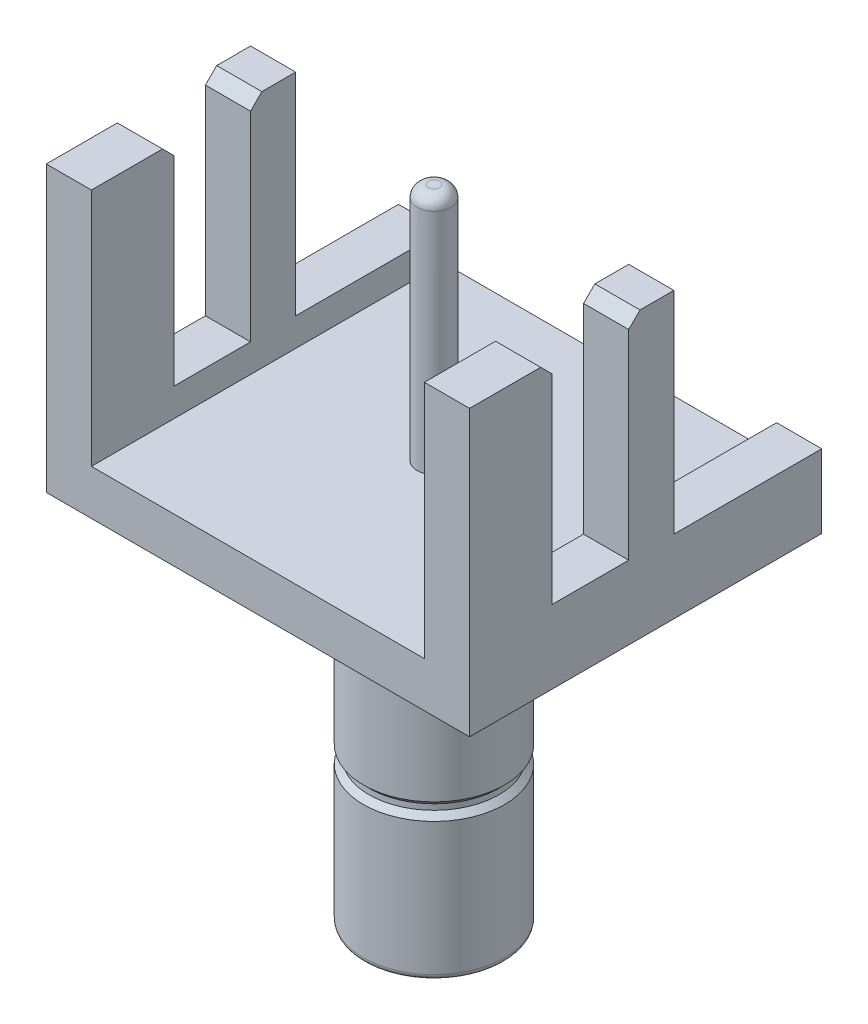
ISO-10303-21;
HEADER;
FILE_DESCRIPTION(('STEP AP214'),'2;1');
FILE_NAME('part.step','',(''),(''),'','','');
FILE_SCHEMA(('AUTOMOTIVE_DESIGN { 1 0 10303 214 1 1 1 1 }'));
ENDSEC;
DATA;
#1=APPLICATION_CONTEXT('core data for automotive mechanical design processes');
#2=APPLICATION_PROTOCOL_DEFINITION('international standard','automotive_design',2000,#1);
#3=PRODUCT_CONTEXT('',#1,'mechanical');
#4=PRODUCT('Part','Part','',(#3));
#5=PRODUCT_RELATED_PRODUCT_CATEGORY('part','',(#4));
#6=PRODUCT_DEFINITION_FORMATION('','',#4);
#7=PRODUCT_DEFINITION_CONTEXT('part definition',#1,'design');
#8=PRODUCT_DEFINITION('design','',#6,#7);
#9=PRODUCT_DEFINITION_SHAPE('','',#8);
#10=(LENGTH_UNIT() NAMED_UNIT(*) SI_UNIT(.MILLI.,.METRE.));
#11=(NAMED_UNIT(*) PLANE_ANGLE_UNIT() SI_UNIT($,.RADIAN.));
#12=(NAMED_UNIT(*) SI_UNIT($,.STERADIAN.) SOLID_ANGLE_UNIT());
#13=UNCERTAINTY_MEASURE_WITH_UNIT(LENGTH_MEASURE(1.E-05),#10,'distance_accuracy_value','');
#14=(GEOMETRIC_REPRESENTATION_CONTEXT(3) GLOBAL_UNCERTAINTY_ASSIGNED_CONTEXT((#13)) GLOBAL_UNIT_ASSIGNED_CONTEXT((#10,
#11,#12)) REPRESENTATION_CONTEXT('',''));
#15=CARTESIAN_POINT('',(0.,0.,0.));
#16=DIRECTION('',(0.,0.,1.));
#17=DIRECTION('',(1.,0.,0.));
#18=AXIS2_PLACEMENT_3D('',#15,#16,#17);
#19=CARTESIAN_POINT('',(0.,-8.001,0.));
#20=DIRECTION('',(0.,1.,0.));
#21=DIRECTION('',(0.,0.,1.));
#22=AXIS2_PLACEMENT_3D('',#19,#20,#21);
#23=CYLINDRICAL_SURFACE('',#22,0.381);
#24=CARTESIAN_POINT('',(0.,0.,0.));
#25=DIRECTION('',(0.,-1.,0.));
#26=DIRECTION('',(0.,0.,-1.));
#27=AXIS2_PLACEMENT_3D('',#24,#25,#26);
#28=CIRCLE('',#27,0.381);
#29=CARTESIAN_POINT('',(0.,0.,-0.381));
#30=VERTEX_POINT('',#29);
#31=EDGE_CURVE('E855',#30,#30,#28,.T.);
#32=ORIENTED_EDGE('',*,*,#31,.T.);
#33=EDGE_LOOP('',(#32));
#34=FACE_BOUND('',#33,.T.);
#35=CARTESIAN_POINT('',(0.,-6.477,0.));
#36=DIRECTION('',(0.,-1.,0.));
#37=DIRECTION('',(0.,0.,-1.));
#38=AXIS2_PLACEMENT_3D('',#35,#36,#37);
#39=CIRCLE('',#38,0.381);
#40=CARTESIAN_POINT('',(0.,-6.477,-0.381));
#41=VERTEX_POINT('',#40);
#42=EDGE_CURVE('E838',#41,#41,#39,.T.);
#43=ORIENTED_EDGE('',*,*,#42,.F.);
#44=EDGE_LOOP('',(#43));
#45=FACE_BOUND('',#44,.T.);
#46=ADVANCED_FACE('F47',(#34,#45),#23,.T.);
#47=CARTESIAN_POINT('',(0.,-8.001,0.));
#48=DIRECTION('',(0.,1.,0.));
#49=DIRECTION('',(0.,0.,1.));
#50=AXIS2_PLACEMENT_3D('',#47,#48,#49);
#51=CYLINDRICAL_SURFACE('',#50,1.5875);
#52=CARTESIAN_POINT('',(0.,-4.5085,0.));
#53=DIRECTION('',(0.,-1.,0.));
#54=DIRECTION('',(0.,0.,-1.));
#55=AXIS2_PLACEMENT_3D('',#52,#53,#54);
#56=CIRCLE('',#55,1.5875);
#57=CARTESIAN_POINT('',(0.,-4.5085,-1.5875));
#58=VERTEX_POINT('',#57);
#59=EDGE_CURVE('E852',#58,#58,#56,.T.);
#60=ORIENTED_EDGE('',*,*,#59,.F.);
#61=EDGE_LOOP('',(#60));
#62=FACE_BOUND('',#61,.T.);
#63=CARTESIAN_POINT('',(0.,0.,0.));
#64=DIRECTION('',(0.,-1.,0.));
#65=DIRECTION('',(0.,0.,-1.));
#66=AXIS2_PLACEMENT_3D('',#63,#64,#65);
#67=CIRCLE('',#66,1.5875);
#68=CARTESIAN_POINT('',(0.,0.,-1.5875));
#69=VERTEX_POINT('',#68);
#70=EDGE_CURVE('E244',#69,#69,#67,.T.);
#71=ORIENTED_EDGE('',*,*,#70,.T.);
#72=EDGE_LOOP('',(#71));
#73=FACE_BOUND('',#72,.T.);
#74=ADVANCED_FACE('F434',(#62,#73),#51,.T.);
#75=CARTESIAN_POINT('',(0.,1.651,0.));
#76=DIRECTION('',(0.,-1.,0.));
#77=DIRECTION('',(0.,0.,-1.));
#78=AXIS2_PLACEMENT_3D('',#75,#76,#77);
#79=PLANE('',#78);
#80=DIRECTION('',(-1.,0.,0.));
#81=VECTOR('',#80,1.);
#82=CARTESIAN_POINT('',(4.7625,1.651,2.1082));
#83=LINE('',#82,#81);
#84=CARTESIAN_POINT('',(4.7625,1.651,2.1082));
#85=VERTEX_POINT('',#84);
#86=CARTESIAN_POINT('',(3.7465,1.651,2.1082));
#87=VERTEX_POINT('',#86);
#88=EDGE_CURVE('E238',#85,#87,#83,.T.);
#89=ORIENTED_EDGE('',*,*,#88,.F.);
#90=DIRECTION('',(0.,0.,-1.));
#91=VECTOR('',#90,1.);
#92=CARTESIAN_POINT('',(4.7625,1.651,-3.9624));
#93=LINE('',#92,#91);
#94=CARTESIAN_POINT('',(4.7625,1.651,0.380999999999999));
#95=VERTEX_POINT('',#94);
#96=EDGE_CURVE('E315',#85,#95,#93,.T.);
#97=ORIENTED_EDGE('',*,*,#96,.T.);
#98=DIRECTION('',(1.,0.,0.));
#99=VECTOR('',#98,1.);
#100=CARTESIAN_POINT('',(4.7625,1.651,0.381));
#101=LINE('',#100,#99);
#102=CARTESIAN_POINT('',(3.7465,1.651,0.380999999999999));
#103=VERTEX_POINT('',#102);
#104=EDGE_CURVE('E257',#103,#95,#101,.T.);
#105=ORIENTED_EDGE('',*,*,#104,.F.);
#106=DIRECTION('',(0.,0.,1.));
#107=VECTOR('',#106,1.);
#108=CARTESIAN_POINT('',(3.7465,1.651,-3.9624));
#109=LINE('',#108,#107);
#110=EDGE_CURVE('E321',#103,#87,#109,.T.);
#111=ORIENTED_EDGE('',*,*,#110,.T.);
#112=EDGE_LOOP('',(#89,#97,#105,#111));
#113=FACE_BOUND('',#112,.T.);
#114=ADVANCED_FACE('F440',(#113),#79,.F.);
#115=DIRECTION('',(-1.,0.,0.));
#116=VECTOR('',#115,1.);
#117=CARTESIAN_POINT('',(4.7625,1.651,-0.635));
#118=LINE('',#117,#116);
#119=CARTESIAN_POINT('',(4.7625,1.651,-0.635));
#120=VERTEX_POINT('',#119);
#121=CARTESIAN_POINT('',(3.7465,1.651,-0.635));
#122=VERTEX_POINT('',#121);
#123=EDGE_CURVE('E252',#120,#122,#118,.T.);
#124=ORIENTED_EDGE('',*,*,#123,.F.);
#125=CARTESIAN_POINT('',(4.7625,1.651,-3.9624));
#126=VERTEX_POINT('',#125);
#127=EDGE_CURVE('E319',#120,#126,#93,.T.);
#128=ORIENTED_EDGE('',*,*,#127,.T.);
#129=DIRECTION('',(-1.,0.,0.));
#130=VECTOR('',#129,1.);
#131=CARTESIAN_POINT('',(4.7625,1.651,-3.9624));
#132=LINE('',#131,#130);
#133=CARTESIAN_POINT('',(3.7465,1.651,-3.9624));
#134=VERTEX_POINT('',#133);
#135=EDGE_CURVE('E318',#126,#134,#132,.T.);
#136=ORIENTED_EDGE('',*,*,#135,.T.);
#137=EDGE_CURVE('E322',#134,#122,#109,.T.);
#138=ORIENTED_EDGE('',*,*,#137,.T.);
#139=EDGE_LOOP('',(#124,#128,#136,#138));
#140=FACE_BOUND('',#139,.T.);
#141=ADVANCED_FACE('F510',(#140),#79,.F.);
#142=CARTESIAN_POINT('',(0.,1.651,0.));
#143=DIRECTION('',(0.,1.,0.));
#144=DIRECTION('',(0.,0.,1.));
#145=AXIS2_PLACEMENT_3D('',#142,#143,#144);
#146=PLANE('',#145);
#147=DIRECTION('',(0.,0.,-1.));
#148=VECTOR('',#147,1.);
#149=CARTESIAN_POINT('',(-3.7465,1.651,-3.9624));
#150=LINE('',#149,#148);
#151=CARTESIAN_POINT('',(-3.7465,1.651,2.1082));
#152=VERTEX_POINT('',#151);
#153=CARTESIAN_POINT('',(-3.7465,1.651,0.381));
#154=VERTEX_POINT('',#153);
#155=EDGE_CURVE('E336',#152,#154,#150,.T.);
#156=ORIENTED_EDGE('',*,*,#155,.T.);
#157=DIRECTION('',(1.,0.,0.));
#158=VECTOR('',#157,1.);
#159=CARTESIAN_POINT('',(-4.7625,1.651,0.381));
#160=LINE('',#159,#158);
#161=CARTESIAN_POINT('',(-4.7625,1.651,0.380999999999999));
#162=VERTEX_POINT('',#161);
#163=EDGE_CURVE('E276',#162,#154,#160,.T.);
#164=ORIENTED_EDGE('',*,*,#163,.F.);
#165=DIRECTION('',(0.,0.,1.));
#166=VECTOR('',#165,1.);
#167=CARTESIAN_POINT('',(-4.7625,1.651,-3.9624));
#168=LINE('',#167,#166);
#169=CARTESIAN_POINT('',(-4.7625,1.651,2.1082));
#170=VERTEX_POINT('',#169);
#171=EDGE_CURVE('E335',#162,#170,#168,.T.);
#172=ORIENTED_EDGE('',*,*,#171,.T.);
#173=DIRECTION('',(-1.,0.,0.));
#174=VECTOR('',#173,1.);
#175=CARTESIAN_POINT('',(-4.7625,1.651,2.1082));
#176=LINE('',#175,#174);
#177=EDGE_CURVE('E299',#152,#170,#176,.T.);
#178=ORIENTED_EDGE('',*,*,#177,.F.);
#179=EDGE_LOOP('',(#156,#164,#172,#178));
#180=FACE_BOUND('',#179,.T.);
#181=ADVANCED_FACE('F513',(#180),#146,.T.);
#182=CARTESIAN_POINT('',(-4.7625,1.651,-3.9624));
#183=VERTEX_POINT('',#182);
#184=CARTESIAN_POINT('',(-4.7625,1.651,-0.635000000000001));
#185=VERTEX_POINT('',#184);
#186=EDGE_CURVE('E332',#183,#185,#168,.T.);
#187=ORIENTED_EDGE('',*,*,#186,.T.);
#188=DIRECTION('',(-1.,0.,0.));
#189=VECTOR('',#188,1.);
#190=CARTESIAN_POINT('',(-4.7625,1.651,-0.635));
#191=LINE('',#190,#189);
#192=CARTESIAN_POINT('',(-3.7465,1.651,-0.635));
#193=VERTEX_POINT('',#192);
#194=EDGE_CURVE('E281',#193,#185,#191,.T.);
#195=ORIENTED_EDGE('',*,*,#194,.F.);
#196=CARTESIAN_POINT('',(-3.7465,1.651,-3.9624));
#197=VERTEX_POINT('',#196);
#198=EDGE_CURVE('E334',#193,#197,#150,.T.);
#199=ORIENTED_EDGE('',*,*,#198,.T.);
#200=DIRECTION('',(-1.,0.,0.));
#201=VECTOR('',#200,1.);
#202=CARTESIAN_POINT('',(-4.7625,1.651,-3.9624));
#203=LINE('',#202,#201);
#204=EDGE_CURVE('E339',#197,#183,#203,.T.);
#205=ORIENTED_EDGE('',*,*,#204,.T.);
#206=EDGE_LOOP('',(#187,#195,#199,#205));
#207=FACE_BOUND('',#206,.T.);
#208=ADVANCED_FACE('F521',(#207),#146,.T.);
#209=CARTESIAN_POINT('',(0.,1.016,0.));
#210=DIRECTION('',(0.,-1.,0.));
#211=DIRECTION('',(0.,0.,-1.));
#212=AXIS2_PLACEMENT_3D('',#209,#210,#211);
#213=PLANE('',#212);
#214=CARTESIAN_POINT('',(0.,1.016,0.));
#215=DIRECTION('',(0.,-1.,0.));
#216=DIRECTION('',(0.,0.,-1.));
#217=AXIS2_PLACEMENT_3D('',#214,#215,#216);
#218=CIRCLE('',#217,0.381);
#219=CARTESIAN_POINT('',(0.,1.016,-0.381));
#220=VERTEX_POINT('',#219);
#221=EDGE_CURVE('E397',#220,#220,#218,.F.);
#222=ORIENTED_EDGE('',*,*,#221,.F.);
#223=EDGE_LOOP('',(#222));
#224=FACE_BOUND('',#223,.T.);
#225=DIRECTION('',(0.,0.,1.));
#226=VECTOR('',#225,1.);
#227=CARTESIAN_POINT('',(3.7465,1.016,-3.9624));
#228=LINE('',#227,#226);
#229=CARTESIAN_POINT('',(3.7465,1.016,-3.9624));
#230=VERTEX_POINT('',#229);
#231=CARTESIAN_POINT('',(3.7465,1.016,3.9624));
#232=VERTEX_POINT('',#231);
#233=EDGE_CURVE('E314',#230,#232,#228,.T.);
#234=ORIENTED_EDGE('',*,*,#233,.F.);
#235=DIRECTION('',(-1.,0.,0.));
#236=VECTOR('',#235,1.);
#237=CARTESIAN_POINT('',(-4.7625,1.016,-3.9624));
#238=LINE('',#237,#236);
#239=CARTESIAN_POINT('',(-3.7465,1.016,-3.9624));
#240=VERTEX_POINT('',#239);
#241=EDGE_CURVE('E362',#230,#240,#238,.T.);
#242=ORIENTED_EDGE('',*,*,#241,.T.);
#243=DIRECTION('',(0.,0.,-1.));
#244=VECTOR('',#243,1.);
#245=CARTESIAN_POINT('',(-3.7465,1.016,-3.9624));
#246=LINE('',#245,#244);
#247=CARTESIAN_POINT('',(-3.7465,1.016,3.9624));
#248=VERTEX_POINT('',#247);
#249=EDGE_CURVE('E331',#248,#240,#246,.T.);
#250=ORIENTED_EDGE('',*,*,#249,.F.);
#251=DIRECTION('',(1.,0.,0.));
#252=VECTOR('',#251,1.);
#253=CARTESIAN_POINT('',(-4.7625,1.016,3.9624));
#254=LINE('',#253,#252);
#255=EDGE_CURVE('E222',#248,#232,#254,.T.);
#256=ORIENTED_EDGE('',*,*,#255,.T.);
#257=EDGE_LOOP('',(#234,#242,#250,#256));
#258=FACE_BOUND('',#257,.T.);
#259=ADVANCED_FACE('F527',(#224,#258),#213,.F.);
#260=CARTESIAN_POINT('',(4.7625,1.016,3.9624));
#261=DIRECTION('',(-1.,0.,0.));
#262=DIRECTION('',(0.,0.,1.));
#263=AXIS2_PLACEMENT_3D('',#260,#261,#262);
#264=PLANE('',#263);
#265=DIRECTION('',(0.,-1.,0.));
#266=VECTOR('',#265,1.);
#267=CARTESIAN_POINT('',(4.7625,6.4008,2.1082));
#268=LINE('',#267,#266);
#269=CARTESIAN_POINT('',(4.7625,6.1468,2.1082));
#270=VERTEX_POINT('',#269);
#271=EDGE_CURVE('E250',#270,#85,#268,.T.);
#272=ORIENTED_EDGE('',*,*,#271,.F.);
#273=DIRECTION('',(0.,-0.70710678118655,-0.707106781186545));
#274=VECTOR('',#273,1.);
#275=CARTESIAN_POINT('',(4.7625,6.4008,2.3622));
#276=LINE('',#275,#274);
#277=CARTESIAN_POINT('',(4.7625,6.4008,2.3622));
#278=VERTEX_POINT('',#277);
#279=EDGE_CURVE('E229',#270,#278,#276,.F.);
#280=ORIENTED_EDGE('',*,*,#279,.T.);
#281=DIRECTION('',(0.,0.,-1.));
#282=VECTOR('',#281,1.);
#283=CARTESIAN_POINT('',(4.7625,6.4008,3.9624));
#284=LINE('',#283,#282);
#285=CARTESIAN_POINT('',(4.7625,6.4008,3.9624));
#286=VERTEX_POINT('',#285);
#287=EDGE_CURVE('E225',#286,#278,#284,.T.);
#288=ORIENTED_EDGE('',*,*,#287,.F.);
#289=DIRECTION('',(0.,-1.,0.));
#290=VECTOR('',#289,1.);
#291=CARTESIAN_POINT('',(4.7625,1.016,3.9624));
#292=LINE('',#291,#290);
#293=CARTESIAN_POINT('',(4.7625,0.,3.9624));
#294=VERTEX_POINT('',#293);
#295=EDGE_CURVE('E210',#286,#294,#292,.T.);
#296=ORIENTED_EDGE('',*,*,#295,.T.);
#297=DIRECTION('',(0.,0.,-1.));
#298=VECTOR('',#297,1.);
#299=CARTESIAN_POINT('',(4.7625,0.,3.9624));
#300=LINE('',#299,#298);
#301=CARTESIAN_POINT('',(4.7625,0.,-3.9624));
#302=VERTEX_POINT('',#301);
#303=EDGE_CURVE('E359',#294,#302,#300,.T.);
#304=ORIENTED_EDGE('',*,*,#303,.T.);
#305=DIRECTION('',(0.,-1.,0.));
#306=VECTOR('',#305,1.);
#307=CARTESIAN_POINT('',(4.7625,1.016,-3.9624));
#308=LINE('',#307,#306);
#309=EDGE_CURVE('E368',#126,#302,#308,.T.);
#310=ORIENTED_EDGE('',*,*,#309,.F.);
#311=ORIENTED_EDGE('',*,*,#127,.F.);
#312=DIRECTION('',(0.,-1.,0.));
#313=VECTOR('',#312,1.);
#314=CARTESIAN_POINT('',(4.7625,6.4008,-0.635));
#315=LINE('',#314,#313);
#316=CARTESIAN_POINT('',(4.7625,6.4008,-0.635));
#317=VERTEX_POINT('',#316);
#318=EDGE_CURVE('E262',#317,#120,#315,.T.);
#319=ORIENTED_EDGE('',*,*,#318,.F.);
#320=DIRECTION('',(0.,0.,-1.));
#321=VECTOR('',#320,1.);
#322=CARTESIAN_POINT('',(4.7625,6.4008,-0.635));
#323=LINE('',#322,#321);
#324=CARTESIAN_POINT('',(4.7625,6.4008,0.126999999999999));
#325=VERTEX_POINT('',#324);
#326=EDGE_CURVE('E260',#325,#317,#323,.T.);
#327=ORIENTED_EDGE('',*,*,#326,.F.);
#328=DIRECTION('',(0.,-0.707106781186548,0.707106781186547));
#329=VECTOR('',#328,1.);
#330=CARTESIAN_POINT('',(4.7625,6.4008,0.126999999999998));
#331=LINE('',#330,#329);
#332=CARTESIAN_POINT('',(4.7625,6.1468,0.381));
#333=VERTEX_POINT('',#332);
#334=EDGE_CURVE('E63',#325,#333,#331,.T.);
#335=ORIENTED_EDGE('',*,*,#334,.T.);
#336=DIRECTION('',(0.,-1.,0.));
#337=VECTOR('',#336,1.);
#338=CARTESIAN_POINT('',(4.7625,6.4008,0.381));
#339=LINE('',#338,#337);
#340=EDGE_CURVE('E269',#333,#95,#339,.T.);
#341=ORIENTED_EDGE('',*,*,#340,.T.);
#342=ORIENTED_EDGE('',*,*,#96,.F.);
#343=EDGE_LOOP('',(#272,#280,#288,#296,#304,#310,#311,#319,#327,#335,#341,#342));
#344=FACE_BOUND('',#343,.T.);
#345=ADVANCED_FACE('F227',(#344),#264,.F.);
#346=CARTESIAN_POINT('',(-4.7625,1.016,-3.9624));
#347=DIRECTION('',(0.,0.,1.));
#348=DIRECTION('',(1.,0.,0.));
#349=AXIS2_PLACEMENT_3D('',#346,#347,#348);
#350=PLANE('',#349);
#351=DIRECTION('',(-1.,0.,0.));
#352=VECTOR('',#351,1.);
#353=CARTESIAN_POINT('',(-4.7625,0.,-3.9624));
#354=LINE('',#353,#352);
#355=CARTESIAN_POINT('',(-4.7625,0.,-3.9624));
#356=VERTEX_POINT('',#355);
#357=EDGE_CURVE('E583',#302,#356,#354,.T.);
#358=ORIENTED_EDGE('',*,*,#357,.T.);
#359=DIRECTION('',(0.,-1.,0.));
#360=VECTOR('',#359,1.);
#361=CARTESIAN_POINT('',(-4.7625,1.016,-3.9624));
#362=LINE('',#361,#360);
#363=EDGE_CURVE('E585',#183,#356,#362,.T.);
#364=ORIENTED_EDGE('',*,*,#363,.F.);
#365=ORIENTED_EDGE('',*,*,#204,.F.);
#366=DIRECTION('',(0.,-1.,0.));
#367=VECTOR('',#366,1.);
#368=CARTESIAN_POINT('',(-3.7465,1.651,-3.9624));
#369=LINE('',#368,#367);
#370=EDGE_CURVE('E342',#197,#240,#369,.T.);
#371=ORIENTED_EDGE('',*,*,#370,.T.);
#372=ORIENTED_EDGE('',*,*,#241,.F.);
#373=DIRECTION('',(0.,-1.,0.));
#374=VECTOR('',#373,1.);
#375=CARTESIAN_POINT('',(3.7465,1.651,-3.9624));
#376=LINE('',#375,#374);
#377=EDGE_CURVE('E328',#134,#230,#376,.T.);
#378=ORIENTED_EDGE('',*,*,#377,.F.);
#379=ORIENTED_EDGE('',*,*,#135,.F.);
#380=ORIENTED_EDGE('',*,*,#309,.T.);
#381=EDGE_LOOP('',(#358,#364,#365,#371,#372,#378,#379,#380));
#382=FACE_BOUND('',#381,.T.);
#383=ADVANCED_FACE('F539',(#382),#350,.F.);
#384=CARTESIAN_POINT('',(-4.7625,1.016,3.9624));
#385=DIRECTION('',(1.,0.,0.));
#386=DIRECTION('',(0.,0.,-1.));
#387=AXIS2_PLACEMENT_3D('',#384,#385,#386);
#388=PLANE('',#387);
#389=DIRECTION('',(0.,0.,1.));
#390=VECTOR('',#389,1.);
#391=CARTESIAN_POINT('',(-4.7625,6.4008,3.9624));
#392=LINE('',#391,#390);
#393=CARTESIAN_POINT('',(-4.7625,6.4008,2.3622));
#394=VERTEX_POINT('',#393);
#395=CARTESIAN_POINT('',(-4.7625,6.4008,3.9624));
#396=VERTEX_POINT('',#395);
#397=EDGE_CURVE('E300',#394,#396,#392,.T.);
#398=ORIENTED_EDGE('',*,*,#397,.F.);
#399=DIRECTION('',(0.,0.70710678118655,0.707106781186545));
#400=VECTOR('',#399,1.);
#401=CARTESIAN_POINT('',(-4.7625,6.4008,2.3622));
#402=LINE('',#401,#400);
#403=CARTESIAN_POINT('',(-4.7625,6.1468,2.1082));
#404=VERTEX_POINT('',#403);
#405=EDGE_CURVE('E370',#394,#404,#402,.F.);
#406=ORIENTED_EDGE('',*,*,#405,.T.);
#407=DIRECTION('',(0.,-1.,0.));
#408=VECTOR('',#407,1.);
#409=CARTESIAN_POINT('',(-4.7625,6.4008,2.1082));
#410=LINE('',#409,#408);
#411=EDGE_CURVE('E308',#404,#170,#410,.T.);
#412=ORIENTED_EDGE('',*,*,#411,.T.);
#413=ORIENTED_EDGE('',*,*,#171,.F.);
#414=DIRECTION('',(0.,-1.,0.));
#415=VECTOR('',#414,1.);
#416=CARTESIAN_POINT('',(-4.7625,6.4008,0.381));
#417=LINE('',#416,#415);
#418=CARTESIAN_POINT('',(-4.7625,6.1468,0.381));
#419=VERTEX_POINT('',#418);
#420=EDGE_CURVE('E297',#419,#162,#417,.T.);
#421=ORIENTED_EDGE('',*,*,#420,.F.);
#422=DIRECTION('',(0.,0.707106781186548,-0.707106781186547));
#423=VECTOR('',#422,1.);
#424=CARTESIAN_POINT('',(-4.7625,6.4008,0.126999999999998));
#425=LINE('',#424,#423);
#426=CARTESIAN_POINT('',(-4.7625,6.4008,0.126999999999999));
#427=VERTEX_POINT('',#426);
#428=EDGE_CURVE('E367',#419,#427,#425,.T.);
#429=ORIENTED_EDGE('',*,*,#428,.T.);
#430=DIRECTION('',(0.,0.,1.));
#431=VECTOR('',#430,1.);
#432=CARTESIAN_POINT('',(-4.7625,6.4008,-0.635));
#433=LINE('',#432,#431);
#434=CARTESIAN_POINT('',(-4.7625,6.4008,-0.635));
#435=VERTEX_POINT('',#434);
#436=EDGE_CURVE('E277',#435,#427,#433,.T.);
#437=ORIENTED_EDGE('',*,*,#436,.F.);
#438=DIRECTION('',(0.,-1.,0.));
#439=VECTOR('',#438,1.);
#440=CARTESIAN_POINT('',(-4.7625,6.4008,-0.635));
#441=LINE('',#440,#439);
#442=EDGE_CURVE('E285',#435,#185,#441,.T.);
#443=ORIENTED_EDGE('',*,*,#442,.T.);
#444=ORIENTED_EDGE('',*,*,#186,.F.);
#445=ORIENTED_EDGE('',*,*,#363,.T.);
#446=DIRECTION('',(0.,0.,1.));
#447=VECTOR('',#446,1.);
#448=CARTESIAN_POINT('',(-4.7625,0.,3.9624));
#449=LINE('',#448,#447);
#450=CARTESIAN_POINT('',(-4.7625,0.,3.9624));
#451=VERTEX_POINT('',#450);
#452=EDGE_CURVE('E589',#356,#451,#449,.T.);
#453=ORIENTED_EDGE('',*,*,#452,.T.);
#454=DIRECTION('',(0.,-1.,0.));
#455=VECTOR('',#454,1.);
#456=CARTESIAN_POINT('',(-4.7625,1.016,3.9624));
#457=LINE('',#456,#455);
#458=EDGE_CURVE('E221',#396,#451,#457,.T.);
#459=ORIENTED_EDGE('',*,*,#458,.F.);
#460=EDGE_LOOP('',(#398,#406,#412,#413,#421,#429,#437,#443,#444,#445,#453,#459));
#461=FACE_BOUND('',#460,.T.);
#462=ADVANCED_FACE('F536',(#461),#388,.F.);
#463=CARTESIAN_POINT('',(-4.7625,1.016,3.9624));
#464=DIRECTION('',(0.,0.,-1.));
#465=DIRECTION('',(-1.,0.,0.));
#466=AXIS2_PLACEMENT_3D('',#463,#464,#465);
#467=PLANE('',#466);
#468=DIRECTION('',(1.,0.,0.));
#469=VECTOR('',#468,1.);
#470=CARTESIAN_POINT('',(-4.7625,0.,3.9624));
#471=LINE('',#470,#469);
#472=EDGE_CURVE('E218',#451,#294,#471,.T.);
#473=ORIENTED_EDGE('',*,*,#472,.T.);
#474=ORIENTED_EDGE('',*,*,#295,.F.);
#475=DIRECTION('',(1.,0.,0.));
#476=VECTOR('',#475,1.);
#477=CARTESIAN_POINT('',(4.7625,6.4008,3.9624));
#478=LINE('',#477,#476);
#479=CARTESIAN_POINT('',(3.7465,6.4008,3.9624));
#480=VERTEX_POINT('',#479);
#481=EDGE_CURVE('E215',#480,#286,#478,.T.);
#482=ORIENTED_EDGE('',*,*,#481,.F.);
#483=DIRECTION('',(0.,-1.,0.));
#484=VECTOR('',#483,1.);
#485=CARTESIAN_POINT('',(3.7465,1.651,3.9624));
#486=LINE('',#485,#484);
#487=EDGE_CURVE('E324',#480,#232,#486,.T.);
#488=ORIENTED_EDGE('',*,*,#487,.T.);
#489=ORIENTED_EDGE('',*,*,#255,.F.);
#490=DIRECTION('',(0.,-1.,0.));
#491=VECTOR('',#490,1.);
#492=CARTESIAN_POINT('',(-3.7465,1.651,3.9624));
#493=LINE('',#492,#491);
#494=CARTESIAN_POINT('',(-3.7465,6.4008,3.9624));
#495=VERTEX_POINT('',#494);
#496=EDGE_CURVE('E354',#495,#248,#493,.T.);
#497=ORIENTED_EDGE('',*,*,#496,.F.);
#498=DIRECTION('',(1.,0.,0.));
#499=VECTOR('',#498,1.);
#500=CARTESIAN_POINT('',(-4.7625,6.4008,3.9624));
#501=LINE('',#500,#499);
#502=EDGE_CURVE('E302',#396,#495,#501,.T.);
#503=ORIENTED_EDGE('',*,*,#502,.F.);
#504=ORIENTED_EDGE('',*,*,#458,.T.);
#505=EDGE_LOOP('',(#473,#474,#482,#488,#489,#497,#503,#504));
#506=FACE_BOUND('',#505,.T.);
#507=ADVANCED_FACE('F212',(#506),#467,.F.);
#508=CARTESIAN_POINT('',(0.,0.,0.));
#509=DIRECTION('',(0.,-1.,0.));
#510=DIRECTION('',(0.,0.,-1.));
#511=AXIS2_PLACEMENT_3D('',#508,#509,#510);
#512=PLANE('',#511);
#513=ORIENTED_EDGE('',*,*,#70,.F.);
#514=EDGE_LOOP('',(#513));
#515=FACE_BOUND('',#514,.T.);
#516=ORIENTED_EDGE('',*,*,#303,.F.);
#517=ORIENTED_EDGE('',*,*,#472,.F.);
#518=ORIENTED_EDGE('',*,*,#452,.F.);
#519=ORIENTED_EDGE('',*,*,#357,.F.);
#520=EDGE_LOOP('',(#516,#517,#518,#519));
#521=FACE_BOUND('',#520,.T.);
#522=ADVANCED_FACE('F525',(#515,#521),#512,.T.);
#523=CARTESIAN_POINT('',(-3.7465,1.651,-3.9624));
#524=DIRECTION('',(-1.,0.,0.));
#525=DIRECTION('',(0.,0.,1.));
#526=AXIS2_PLACEMENT_3D('',#523,#524,#525);
#527=PLANE('',#526);
#528=DIRECTION('',(0.,-1.,0.));
#529=VECTOR('',#528,1.);
#530=CARTESIAN_POINT('',(-3.7465,6.4008,2.1082));
#531=LINE('',#530,#529);
#532=CARTESIAN_POINT('',(-3.7465,6.1468,2.1082));
#533=VERTEX_POINT('',#532);
#534=EDGE_CURVE('E312',#533,#152,#531,.T.);
#535=ORIENTED_EDGE('',*,*,#534,.F.);
#536=DIRECTION('',(0.,-0.70710678118655,-0.707106781186545));
#537=VECTOR('',#536,1.);
#538=CARTESIAN_POINT('',(-3.7465,6.4008,2.3622));
#539=LINE('',#538,#537);
#540=CARTESIAN_POINT('',(-3.7465,6.4008,2.3622));
#541=VERTEX_POINT('',#540);
#542=EDGE_CURVE('E376',#533,#541,#539,.F.);
#543=ORIENTED_EDGE('',*,*,#542,.T.);
#544=DIRECTION('',(0.,0.,-1.));
#545=VECTOR('',#544,1.);
#546=CARTESIAN_POINT('',(-3.7465,6.4008,3.9624));
#547=LINE('',#546,#545);
#548=EDGE_CURVE('E305',#495,#541,#547,.T.);
#549=ORIENTED_EDGE('',*,*,#548,.F.);
#550=ORIENTED_EDGE('',*,*,#496,.T.);
#551=ORIENTED_EDGE('',*,*,#249,.T.);
#552=ORIENTED_EDGE('',*,*,#370,.F.);
#553=ORIENTED_EDGE('',*,*,#198,.F.);
#554=DIRECTION('',(0.,-1.,0.));
#555=VECTOR('',#554,1.);
#556=CARTESIAN_POINT('',(-3.7465,6.4008,-0.635));
#557=LINE('',#556,#555);
#558=CARTESIAN_POINT('',(-3.7465,6.4008,-0.635));
#559=VERTEX_POINT('',#558);
#560=EDGE_CURVE('E292',#559,#193,#557,.T.);
#561=ORIENTED_EDGE('',*,*,#560,.F.);
#562=DIRECTION('',(0.,0.,-1.));
#563=VECTOR('',#562,1.);
#564=CARTESIAN_POINT('',(-3.7465,6.4008,-0.635));
#565=LINE('',#564,#563);
#566=CARTESIAN_POINT('',(-3.7465,6.4008,0.126999999999998));
#567=VERTEX_POINT('',#566);
#568=EDGE_CURVE('E280',#567,#559,#565,.T.);
#569=ORIENTED_EDGE('',*,*,#568,.F.);
#570=DIRECTION('',(0.,-0.707106781186548,0.707106781186547));
#571=VECTOR('',#570,1.);
#572=CARTESIAN_POINT('',(-3.7465,6.4008,0.126999999999998));
#573=LINE('',#572,#571);
#574=CARTESIAN_POINT('',(-3.7465,6.1468,0.380999999999999));
#575=VERTEX_POINT('',#574);
#576=EDGE_CURVE('E374',#567,#575,#573,.T.);
#577=ORIENTED_EDGE('',*,*,#576,.T.);
#578=DIRECTION('',(0.,-1.,0.));
#579=VECTOR('',#578,1.);
#580=CARTESIAN_POINT('',(-3.7465,6.4008,0.380999999999999));
#581=LINE('',#580,#579);
#582=EDGE_CURVE('E295',#575,#154,#581,.T.);
#583=ORIENTED_EDGE('',*,*,#582,.T.);
#584=ORIENTED_EDGE('',*,*,#155,.F.);
#585=EDGE_LOOP('',(#535,#543,#549,#550,#551,#552,#553,#561,#569,#577,#583,#584));
#586=FACE_BOUND('',#585,.T.);
#587=ADVANCED_FACE('F517',(#586),#527,.F.);
#588=CARTESIAN_POINT('',(3.7465,1.651,-3.9624));
#589=DIRECTION('',(1.,0.,0.));
#590=DIRECTION('',(0.,0.,-1.));
#591=AXIS2_PLACEMENT_3D('',#588,#589,#590);
#592=PLANE('',#591);
#593=DIRECTION('',(0.,0.,1.));
#594=VECTOR('',#593,1.);
#595=CARTESIAN_POINT('',(3.7465,6.4008,3.9624));
#596=LINE('',#595,#594);
#597=CARTESIAN_POINT('',(3.7465,6.4008,2.3622));
#598=VERTEX_POINT('',#597);
#599=EDGE_CURVE('E233',#598,#480,#596,.T.);
#600=ORIENTED_EDGE('',*,*,#599,.F.);
#601=DIRECTION('',(0.,0.70710678118655,0.707106781186545));
#602=VECTOR('',#601,1.);
#603=CARTESIAN_POINT('',(3.7465,6.4008,2.3622));
#604=LINE('',#603,#602);
#605=CARTESIAN_POINT('',(3.7465,6.1468,2.1082));
#606=VERTEX_POINT('',#605);
#607=EDGE_CURVE('E382',#598,#606,#604,.F.);
#608=ORIENTED_EDGE('',*,*,#607,.T.);
#609=DIRECTION('',(0.,-1.,0.));
#610=VECTOR('',#609,1.);
#611=CARTESIAN_POINT('',(3.7465,6.4008,2.1082));
#612=LINE('',#611,#610);
#613=EDGE_CURVE('E247',#606,#87,#612,.T.);
#614=ORIENTED_EDGE('',*,*,#613,.T.);
#615=ORIENTED_EDGE('',*,*,#110,.F.);
#616=DIRECTION('',(0.,-1.,0.));
#617=VECTOR('',#616,1.);
#618=CARTESIAN_POINT('',(3.7465,6.4008,0.380999999999999));
#619=LINE('',#618,#617);
#620=CARTESIAN_POINT('',(3.7465,6.1468,0.380999999999999));
#621=VERTEX_POINT('',#620);
#622=EDGE_CURVE('E271',#621,#103,#619,.T.);
#623=ORIENTED_EDGE('',*,*,#622,.F.);
#624=DIRECTION('',(0.,0.707106781186548,-0.707106781186547));
#625=VECTOR('',#624,1.);
#626=CARTESIAN_POINT('',(3.7465,6.4008,0.126999999999998));
#627=LINE('',#626,#625);
#628=CARTESIAN_POINT('',(3.7465,6.4008,0.126999999999999));
#629=VERTEX_POINT('',#628);
#630=EDGE_CURVE('E380',#621,#629,#627,.T.);
#631=ORIENTED_EDGE('',*,*,#630,.T.);
#632=DIRECTION('',(0.,0.,1.));
#633=VECTOR('',#632,1.);
#634=CARTESIAN_POINT('',(3.7465,6.4008,-0.635));
#635=LINE('',#634,#633);
#636=CARTESIAN_POINT('',(3.7465,6.4008,-0.635));
#637=VERTEX_POINT('',#636);
#638=EDGE_CURVE('E256',#637,#629,#635,.T.);
#639=ORIENTED_EDGE('',*,*,#638,.F.);
#640=DIRECTION('',(0.,-1.,0.));
#641=VECTOR('',#640,1.);
#642=CARTESIAN_POINT('',(3.7465,6.4008,-0.635));
#643=LINE('',#642,#641);
#644=EDGE_CURVE('E273',#637,#122,#643,.T.);
#645=ORIENTED_EDGE('',*,*,#644,.T.);
#646=ORIENTED_EDGE('',*,*,#137,.F.);
#647=ORIENTED_EDGE('',*,*,#377,.T.);
#648=ORIENTED_EDGE('',*,*,#233,.T.);
#649=ORIENTED_EDGE('',*,*,#487,.F.);
#650=EDGE_LOOP('',(#600,#608,#614,#615,#623,#631,#639,#645,#646,#647,#648,#649));
#651=FACE_BOUND('',#650,.T.);
#652=ADVANCED_FACE('F508',(#651),#592,.F.);
#653=CARTESIAN_POINT('',(-4.7625,6.4008,2.1082));
#654=DIRECTION('',(0.,0.,1.));
#655=DIRECTION('',(1.,0.,0.));
#656=AXIS2_PLACEMENT_3D('',#653,#654,#655);
#657=PLANE('',#656);
#658=ORIENTED_EDGE('',*,*,#411,.F.);
#659=DIRECTION('',(1.,0.,0.));
#660=VECTOR('',#659,1.);
#661=CARTESIAN_POINT('',(-4.7625,6.1468,2.1082));
#662=LINE('',#661,#660);
#663=EDGE_CURVE('E372',#404,#533,#662,.T.);
#664=ORIENTED_EDGE('',*,*,#663,.T.);
#665=ORIENTED_EDGE('',*,*,#534,.T.);
#666=ORIENTED_EDGE('',*,*,#177,.T.);
#667=EDGE_LOOP('',(#658,#664,#665,#666));
#668=FACE_BOUND('',#667,.T.);
#669=ADVANCED_FACE('F504',(#668),#657,.F.);
#670=CARTESIAN_POINT('',(0.,6.4008,0.));
#671=DIRECTION('',(0.,-1.,0.));
#672=DIRECTION('',(0.,0.,-1.));
#673=AXIS2_PLACEMENT_3D('',#670,#671,#672);
#674=PLANE('',#673);
#675=ORIENTED_EDGE('',*,*,#548,.T.);
#676=DIRECTION('',(-1.,0.,0.));
#677=VECTOR('',#676,1.);
#678=CARTESIAN_POINT('',(0.,6.4008,2.3622));
#679=LINE('',#678,#677);
#680=EDGE_CURVE('E364',#541,#394,#679,.T.);
#681=ORIENTED_EDGE('',*,*,#680,.T.);
#682=ORIENTED_EDGE('',*,*,#397,.T.);
#683=ORIENTED_EDGE('',*,*,#502,.T.);
#684=EDGE_LOOP('',(#675,#681,#682,#683));
#685=FACE_BOUND('',#684,.T.);
#686=ADVANCED_FACE('F500',(#685),#674,.F.);
#687=CARTESIAN_POINT('',(-4.7625,6.4008,0.381));
#688=DIRECTION('',(0.,0.,-1.));
#689=DIRECTION('',(-1.,0.,0.));
#690=AXIS2_PLACEMENT_3D('',#687,#688,#689);
#691=PLANE('',#690);
#692=ORIENTED_EDGE('',*,*,#582,.F.);
#693=DIRECTION('',(-1.,0.,0.));
#694=VECTOR('',#693,1.);
#695=CARTESIAN_POINT('',(-4.7625,6.1468,0.381));
#696=LINE('',#695,#694);
#697=EDGE_CURVE('E395',#575,#419,#696,.T.);
#698=ORIENTED_EDGE('',*,*,#697,.T.);
#699=ORIENTED_EDGE('',*,*,#420,.T.);
#700=ORIENTED_EDGE('',*,*,#163,.T.);
#701=EDGE_LOOP('',(#692,#698,#699,#700));
#702=FACE_BOUND('',#701,.T.);
#703=ADVANCED_FACE('F496',(#702),#691,.F.);
#704=CARTESIAN_POINT('',(-4.7625,6.4008,-0.635));
#705=DIRECTION('',(0.,0.,1.));
#706=DIRECTION('',(1.,0.,0.));
#707=AXIS2_PLACEMENT_3D('',#704,#705,#706);
#708=PLANE('',#707);
#709=ORIENTED_EDGE('',*,*,#194,.T.);
#710=ORIENTED_EDGE('',*,*,#442,.F.);
#711=DIRECTION('',(-1.,0.,0.));
#712=VECTOR('',#711,1.);
#713=CARTESIAN_POINT('',(-4.7625,6.4008,-0.635));
#714=LINE('',#713,#712);
#715=EDGE_CURVE('E283',#559,#435,#714,.T.);
#716=ORIENTED_EDGE('',*,*,#715,.F.);
#717=ORIENTED_EDGE('',*,*,#560,.T.);
#718=EDGE_LOOP('',(#709,#710,#716,#717));
#719=FACE_BOUND('',#718,.T.);
#720=ADVANCED_FACE('F492',(#719),#708,.F.);
#721=CARTESIAN_POINT('',(0.,6.4008,0.));
#722=DIRECTION('',(0.,1.,0.));
#723=DIRECTION('',(0.,0.,1.));
#724=AXIS2_PLACEMENT_3D('',#721,#722,#723);
#725=PLANE('',#724);
#726=ORIENTED_EDGE('',*,*,#436,.T.);
#727=DIRECTION('',(1.,0.,0.));
#728=VECTOR('',#727,1.);
#729=CARTESIAN_POINT('',(-3.7465,6.4008,0.126999999999999));
#730=LINE('',#729,#728);
#731=EDGE_CURVE('E392',#427,#567,#730,.T.);
#732=ORIENTED_EDGE('',*,*,#731,.T.);
#733=ORIENTED_EDGE('',*,*,#568,.T.);
#734=ORIENTED_EDGE('',*,*,#715,.T.);
#735=EDGE_LOOP('',(#726,#732,#733,#734));
#736=FACE_BOUND('',#735,.T.);
#737=ADVANCED_FACE('F488',(#736),#725,.T.);
#738=CARTESIAN_POINT('',(4.7625,6.4008,-0.635));
#739=DIRECTION('',(0.,0.,1.));
#740=DIRECTION('',(1.,0.,0.));
#741=AXIS2_PLACEMENT_3D('',#738,#739,#740);
#742=PLANE('',#741);
#743=ORIENTED_EDGE('',*,*,#123,.T.);
#744=ORIENTED_EDGE('',*,*,#644,.F.);
#745=DIRECTION('',(-1.,0.,0.));
#746=VECTOR('',#745,1.);
#747=CARTESIAN_POINT('',(4.7625,6.4008,-0.635));
#748=LINE('',#747,#746);
#749=EDGE_CURVE('E253',#317,#637,#748,.T.);
#750=ORIENTED_EDGE('',*,*,#749,.F.);
#751=ORIENTED_EDGE('',*,*,#318,.T.);
#752=EDGE_LOOP('',(#743,#744,#750,#751));
#753=FACE_BOUND('',#752,.T.);
#754=ADVANCED_FACE('F484',(#753),#742,.F.);
#755=CARTESIAN_POINT('',(4.7625,6.4008,0.381));
#756=DIRECTION('',(0.,0.,-1.));
#757=DIRECTION('',(-1.,0.,0.));
#758=AXIS2_PLACEMENT_3D('',#755,#756,#757);
#759=PLANE('',#758);
#760=ORIENTED_EDGE('',*,*,#340,.F.);
#761=DIRECTION('',(-1.,0.,0.));
#762=VECTOR('',#761,1.);
#763=CARTESIAN_POINT('',(3.7465,6.1468,0.380999999999999));
#764=LINE('',#763,#762);
#765=EDGE_CURVE('E390',#333,#621,#764,.T.);
#766=ORIENTED_EDGE('',*,*,#765,.T.);
#767=ORIENTED_EDGE('',*,*,#622,.T.);
#768=ORIENTED_EDGE('',*,*,#104,.T.);
#769=EDGE_LOOP('',(#760,#766,#767,#768));
#770=FACE_BOUND('',#769,.T.);
#771=ADVANCED_FACE('F480',(#770),#759,.F.);
#772=CARTESIAN_POINT('',(0.,6.4008,0.));
#773=DIRECTION('',(0.,1.,0.));
#774=DIRECTION('',(0.,0.,1.));
#775=AXIS2_PLACEMENT_3D('',#772,#773,#774);
#776=PLANE('',#775);
#777=ORIENTED_EDGE('',*,*,#638,.T.);
#778=DIRECTION('',(1.,0.,0.));
#779=VECTOR('',#778,1.);
#780=CARTESIAN_POINT('',(4.7625,6.4008,0.126999999999999));
#781=LINE('',#780,#779);
#782=EDGE_CURVE('E388',#629,#325,#781,.T.);
#783=ORIENTED_EDGE('',*,*,#782,.T.);
#784=ORIENTED_EDGE('',*,*,#326,.T.);
#785=ORIENTED_EDGE('',*,*,#749,.T.);
#786=EDGE_LOOP('',(#777,#783,#784,#785));
#787=FACE_BOUND('',#786,.T.);
#788=ADVANCED_FACE('F476',(#787),#776,.T.);
#789=CARTESIAN_POINT('',(4.7625,6.4008,2.1082));
#790=DIRECTION('',(0.,0.,1.));
#791=DIRECTION('',(1.,0.,0.));
#792=AXIS2_PLACEMENT_3D('',#789,#790,#791);
#793=PLANE('',#792);
#794=ORIENTED_EDGE('',*,*,#613,.F.);
#795=DIRECTION('',(1.,0.,0.));
#796=VECTOR('',#795,1.);
#797=CARTESIAN_POINT('',(4.7625,6.1468,2.1082));
#798=LINE('',#797,#796);
#799=EDGE_CURVE('E384',#606,#270,#798,.T.);
#800=ORIENTED_EDGE('',*,*,#799,.T.);
#801=ORIENTED_EDGE('',*,*,#271,.T.);
#802=ORIENTED_EDGE('',*,*,#88,.T.);
#803=EDGE_LOOP('',(#794,#800,#801,#802));
#804=FACE_BOUND('',#803,.T.);
#805=ADVANCED_FACE('F473',(#804),#793,.F.);
#806=CARTESIAN_POINT('',(0.,6.4008,0.));
#807=DIRECTION('',(0.,-1.,0.));
#808=DIRECTION('',(0.,0.,-1.));
#809=AXIS2_PLACEMENT_3D('',#806,#807,#808);
#810=PLANE('',#809);
#811=ORIENTED_EDGE('',*,*,#287,.T.);
#812=DIRECTION('',(-1.,0.,0.));
#813=VECTOR('',#812,1.);
#814=CARTESIAN_POINT('',(0.,6.4008,2.3622));
#815=LINE('',#814,#813);
#816=EDGE_CURVE('E378',#278,#598,#815,.T.);
#817=ORIENTED_EDGE('',*,*,#816,.T.);
#818=ORIENTED_EDGE('',*,*,#599,.T.);
#819=ORIENTED_EDGE('',*,*,#481,.T.);
#820=EDGE_LOOP('',(#811,#817,#818,#819));
#821=FACE_BOUND('',#820,.T.);
#822=ADVANCED_FACE('F235',(#821),#810,.F.);
#823=CARTESIAN_POINT('',(0.,6.4008,2.3622));
#824=DIRECTION('',(0.,-0.707106781186545,0.70710678118655));
#825=DIRECTION('',(-1.,0.,0.));
#826=AXIS2_PLACEMENT_3D('',#823,#824,#825);
#827=PLANE('',#826);
#828=ORIENTED_EDGE('',*,*,#542,.F.);
#829=ORIENTED_EDGE('',*,*,#663,.F.);
#830=ORIENTED_EDGE('',*,*,#405,.F.);
#831=ORIENTED_EDGE('',*,*,#680,.F.);
#832=EDGE_LOOP('',(#828,#829,#830,#831));
#833=FACE_BOUND('',#832,.T.);
#834=ADVANCED_FACE('F472',(#833),#827,.F.);
#835=CARTESIAN_POINT('',(0.,6.4008,2.3622));
#836=DIRECTION('',(0.,-0.707106781186545,0.70710678118655));
#837=DIRECTION('',(-1.,0.,0.));
#838=AXIS2_PLACEMENT_3D('',#835,#836,#837);
#839=PLANE('',#838);
#840=ORIENTED_EDGE('',*,*,#279,.F.);
#841=ORIENTED_EDGE('',*,*,#799,.F.);
#842=ORIENTED_EDGE('',*,*,#607,.F.);
#843=ORIENTED_EDGE('',*,*,#816,.F.);
#844=EDGE_LOOP('',(#840,#841,#842,#843));
#845=FACE_BOUND('',#844,.T.);
#846=ADVANCED_FACE('F548',(#845),#839,.F.);
#847=CARTESIAN_POINT('',(0.,6.4008,0.126999999999998));
#848=DIRECTION('',(0.,0.707106781186547,0.707106781186548));
#849=DIRECTION('',(-1.,0.,0.));
#850=AXIS2_PLACEMENT_3D('',#847,#848,#849);
#851=PLANE('',#850);
#852=ORIENTED_EDGE('',*,*,#630,.F.);
#853=ORIENTED_EDGE('',*,*,#765,.F.);
#854=ORIENTED_EDGE('',*,*,#334,.F.);
#855=ORIENTED_EDGE('',*,*,#782,.F.);
#856=EDGE_LOOP('',(#852,#853,#854,#855));
#857=FACE_BOUND('',#856,.T.);
#858=ADVANCED_FACE('F552',(#857),#851,.T.);
#859=CARTESIAN_POINT('',(0.,6.4008,0.126999999999998));
#860=DIRECTION('',(0.,0.707106781186547,0.707106781186548));
#861=DIRECTION('',(-1.,0.,0.));
#862=AXIS2_PLACEMENT_3D('',#859,#860,#861);
#863=PLANE('',#862);
#864=ORIENTED_EDGE('',*,*,#428,.F.);
#865=ORIENTED_EDGE('',*,*,#697,.F.);
#866=ORIENTED_EDGE('',*,*,#576,.F.);
#867=ORIENTED_EDGE('',*,*,#731,.F.);
#868=EDGE_LOOP('',(#864,#865,#866,#867));
#869=FACE_BOUND('',#868,.T.);
#870=ADVANCED_FACE('F464',(#869),#863,.T.);
#871=CARTESIAN_POINT('',(0.,7.4784307345283,0.));
#872=DIRECTION('',(0.,-1.,0.));
#873=DIRECTION('',(0.,0.,-1.));
#874=AXIS2_PLACEMENT_3D('',#871,#872,#873);
#875=CYLINDRICAL_SURFACE('',#874,0.381);
#876=CARTESIAN_POINT('',(0.,6.1468,0.));
#877=DIRECTION('',(0.,1.,0.));
#878=DIRECTION('',(0.,0.,1.));
#879=AXIS2_PLACEMENT_3D('',#876,#877,#878);
#880=CIRCLE('',#879,0.381);
#881=CARTESIAN_POINT('',(0.,6.1468,0.381));
#882=VERTEX_POINT('',#881);
#883=EDGE_CURVE('E403',#882,#882,#880,.F.);
#884=ORIENTED_EDGE('',*,*,#883,.T.);
#885=EDGE_LOOP('',(#884));
#886=FACE_BOUND('',#885,.T.);
#887=ORIENTED_EDGE('',*,*,#221,.T.);
#888=EDGE_LOOP('',(#887));
#889=FACE_BOUND('',#888,.T.);
#890=ADVANCED_FACE('F460',(#886,#889),#875,.T.);
#891=CARTESIAN_POINT('',(0.,6.4008,0.));
#892=DIRECTION('',(0.,1.,0.));
#893=DIRECTION('',(0.,0.,1.));
#894=AXIS2_PLACEMENT_3D('',#891,#892,#893);
#895=PLANE('',#894);
#896=CARTESIAN_POINT('',(0.,6.4008,0.));
#897=DIRECTION('',(0.,1.,0.));
#898=DIRECTION('',(0.,0.,1.));
#899=AXIS2_PLACEMENT_3D('',#896,#897,#898);
#900=CIRCLE('',#899,0.127);
#901=CARTESIAN_POINT('',(0.,6.4008,0.127));
#902=VERTEX_POINT('',#901);
#903=EDGE_CURVE('E400',#902,#902,#900,.T.);
#904=ORIENTED_EDGE('',*,*,#903,.T.);
#905=EDGE_LOOP('',(#904));
#906=FACE_BOUND('',#905,.T.);
#907=ADVANCED_FACE('F463',(#906),#895,.T.);
#908=CARTESIAN_POINT('',(0.,6.1468,0.));
#909=DIRECTION('',(0.,1.,0.));
#910=DIRECTION('',(0.,0.,1.));
#911=AXIS2_PLACEMENT_3D('',#908,#909,#910);
#912=DEGENERATE_TOROIDAL_SURFACE('',#911,0.127,0.254,.T.);
#913=ORIENTED_EDGE('',*,*,#883,.F.);
#914=EDGE_LOOP('',(#913));
#915=FACE_BOUND('',#914,.T.);
#916=ORIENTED_EDGE('',*,*,#903,.F.);
#917=EDGE_LOOP('',(#916));
#918=FACE_BOUND('',#917,.T.);
#919=ADVANCED_FACE('F468',(#915,#918),#912,.T.);
#920=CARTESIAN_POINT('',(0.,-4.5085,0.));
#921=DIRECTION('',(0.,1.,0.));
#922=DIRECTION('',(0.,0.,1.));
#923=AXIS2_PLACEMENT_3D('',#920,#921,#922);
#924=CONICAL_SURFACE('',#923,1.5875,0.785398163397453);
#925=CARTESIAN_POINT('',(0.,-4.6355,0.));
#926=DIRECTION('',(0.,-1.,0.));
#927=DIRECTION('',(0.,0.,-1.));
#928=AXIS2_PLACEMENT_3D('',#925,#926,#927);
#929=CIRCLE('',#928,1.4605);
#930=CARTESIAN_POINT('',(0.,-4.6355,-1.4605));
#931=VERTEX_POINT('',#930);
#932=EDGE_CURVE('E849',#931,#931,#929,.T.);
#933=ORIENTED_EDGE('',*,*,#932,.F.);
#934=EDGE_LOOP('',(#933));
#935=FACE_BOUND('',#934,.T.);
#936=ORIENTED_EDGE('',*,*,#59,.T.);
#937=EDGE_LOOP('',(#936));
#938=FACE_BOUND('',#937,.T.);
#939=ADVANCED_FACE('F448',(#935,#938),#924,.T.);
#940=CARTESIAN_POINT('',(0.,-8.001,0.));
#941=DIRECTION('',(0.,-1.,0.));
#942=DIRECTION('',(0.,0.,-1.));
#943=AXIS2_PLACEMENT_3D('',#940,#941,#942);
#944=CYLINDRICAL_SURFACE('',#943,1.4605);
#945=CARTESIAN_POINT('',(0.,-4.7625,0.));
#946=DIRECTION('',(0.,-1.,0.));
#947=DIRECTION('',(0.,0.,-1.));
#948=AXIS2_PLACEMENT_3D('',#945,#946,#947);
#949=CIRCLE('',#948,1.4605);
#950=CARTESIAN_POINT('',(0.,-4.7625,-1.4605));
#951=VERTEX_POINT('',#950);
#952=EDGE_CURVE('E844',#951,#951,#949,.T.);
#953=ORIENTED_EDGE('',*,*,#952,.F.);
#954=EDGE_LOOP('',(#953));
#955=FACE_BOUND('',#954,.T.);
#956=ORIENTED_EDGE('',*,*,#932,.T.);
#957=EDGE_LOOP('',(#956));
#958=FACE_BOUND('',#957,.T.);
#959=ADVANCED_FACE('F564',(#955,#958),#944,.T.);
#960=CARTESIAN_POINT('',(0.,-4.7625,0.));
#961=DIRECTION('',(0.,-1.,0.));
#962=DIRECTION('',(0.,0.,-1.));
#963=AXIS2_PLACEMENT_3D('',#960,#961,#962);
#964=CONICAL_SURFACE('',#963,1.4605,0.785398163397453);
#965=CARTESIAN_POINT('',(0.,-4.8895,0.));
#966=DIRECTION('',(0.,-1.,0.));
#967=DIRECTION('',(0.,0.,-1.));
#968=AXIS2_PLACEMENT_3D('',#965,#966,#967);
#969=CIRCLE('',#968,1.5875);
#970=CARTESIAN_POINT('',(0.,-4.8895,-1.5875));
#971=VERTEX_POINT('',#970);
#972=EDGE_CURVE('E840',#971,#971,#969,.T.);
#973=ORIENTED_EDGE('',*,*,#972,.F.);
#974=EDGE_LOOP('',(#973));
#975=FACE_BOUND('',#974,.T.);
#976=ORIENTED_EDGE('',*,*,#952,.T.);
#977=EDGE_LOOP('',(#976));
#978=FACE_BOUND('',#977,.T.);
#979=ADVANCED_FACE('F749',(#975,#978),#964,.T.);
#980=ORIENTED_EDGE('',*,*,#31,.F.);
#981=EDGE_LOOP('',(#980));
#982=FACE_BOUND('',#981,.T.);
#983=CARTESIAN_POINT('',(0.,0.,0.));
#984=DIRECTION('',(0.,-1.,0.));
#985=DIRECTION('',(0.,0.,-1.));
#986=AXIS2_PLACEMENT_3D('',#983,#984,#985);
#987=CIRCLE('',#986,1.27);
#988=CARTESIAN_POINT('',(0.,0.,-1.27));
#989=VERTEX_POINT('',#988);
#990=EDGE_CURVE('E406',#989,#989,#987,.F.);
#991=ORIENTED_EDGE('',*,*,#990,.F.);
#992=EDGE_LOOP('',(#991));
#993=FACE_BOUND('',#992,.T.);
#994=ADVANCED_FACE('F458',(#982,#993),#512,.T.);
#995=CARTESIAN_POINT('',(0.,-8.001,0.));
#996=DIRECTION('',(0.,1.,0.));
#997=DIRECTION('',(0.,0.,1.));
#998=AXIS2_PLACEMENT_3D('',#995,#996,#997);
#999=CYLINDRICAL_SURFACE('',#998,1.27);
#1000=CARTESIAN_POINT('',(0.,-8.001,0.));
#1001=DIRECTION('',(0.,-1.,0.));
#1002=DIRECTION('',(0.,0.,-1.));
#1003=AXIS2_PLACEMENT_3D('',#1000,#1001,#1002);
#1004=CIRCLE('',#1003,1.27);
#1005=CARTESIAN_POINT('',(0.,-8.001,-1.27));
#1006=VERTEX_POINT('',#1005);
#1007=EDGE_CURVE('E241',#1006,#1006,#1004,.T.);
#1008=ORIENTED_EDGE('',*,*,#1007,.T.);
#1009=EDGE_LOOP('',(#1008));
#1010=FACE_BOUND('',#1009,.T.);
#1011=ORIENTED_EDGE('',*,*,#990,.T.);
#1012=EDGE_LOOP('',(#1011));
#1013=FACE_BOUND('',#1012,.T.);
#1014=ADVANCED_FACE('F451',(#1010,#1013),#999,.F.);
#1015=CARTESIAN_POINT('',(0.,-8.001,0.));
#1016=DIRECTION('',(0.,-1.,0.));
#1017=DIRECTION('',(0.,0.,-1.));
#1018=AXIS2_PLACEMENT_3D('',#1015,#1016,#1017);
#1019=PLANE('',#1018);
#1020=CARTESIAN_POINT('',(0.,-8.001,0.));
#1021=DIRECTION('',(0.,-1.,0.));
#1022=DIRECTION('',(0.,0.,-1.));
#1023=AXIS2_PLACEMENT_3D('',#1020,#1021,#1022);
#1024=CIRCLE('',#1023,1.4605);
#1025=CARTESIAN_POINT('',(0.,-8.001,-1.4605));
#1026=VERTEX_POINT('',#1025);
#1027=EDGE_CURVE('E56',#1026,#1026,#1024,.T.);
#1028=ORIENTED_EDGE('',*,*,#1027,.T.);
#1029=EDGE_LOOP('',(#1028));
#1030=FACE_BOUND('',#1029,.T.);
#1031=ORIENTED_EDGE('',*,*,#1007,.F.);
#1032=EDGE_LOOP('',(#1031));
#1033=FACE_BOUND('',#1032,.T.);
#1034=ADVANCED_FACE('F421',(#1030,#1033),#1019,.T.);
#1035=CARTESIAN_POINT('',(0.,-7.874,0.));
#1036=DIRECTION('',(0.,-1.,0.));
#1037=DIRECTION('',(0.,0.,-1.));
#1038=AXIS2_PLACEMENT_3D('',#1035,#1036,#1037);
#1039=CIRCLE('',#1038,1.5875);
#1040=CARTESIAN_POINT('',(0.,-7.874,-1.5875));
#1041=VERTEX_POINT('',#1040);
#1042=EDGE_CURVE('E12',#1041,#1041,#1039,.F.);
#1043=ORIENTED_EDGE('',*,*,#1042,.T.);
#1044=EDGE_LOOP('',(#1043));
#1045=FACE_BOUND('',#1044,.T.);
#1046=ORIENTED_EDGE('',*,*,#972,.T.);
#1047=EDGE_LOOP('',(#1046));
#1048=FACE_BOUND('',#1047,.T.);
#1049=ADVANCED_FACE('F443',(#1045,#1048),#51,.T.);
#1050=CARTESIAN_POINT('',(0.,-6.477,0.));
#1051=DIRECTION('',(0.,1.,0.));
#1052=DIRECTION('',(0.,0.,-1.));
#1053=AXIS2_PLACEMENT_3D('',#1050,#1051,#1052);
#1054=CONICAL_SURFACE('',#1053,0.381,0.26179938779915);
#1055=CARTESIAN_POINT('',(0.,-7.14487001872802,0.));
#1056=DIRECTION('',(0.,1.,0.));
#1057=DIRECTION('',(0.,0.,1.));
#1058=AXIS2_PLACEMENT_3D('',#1055,#1056,#1057);
#1059=CIRCLE('',#1058,0.202044767832868);
#1060=CARTESIAN_POINT('',(0.,-7.14487001872802,0.202044767832868));
#1061=VERTEX_POINT('',#1060);
#1062=EDGE_CURVE('E413',#1061,#1061,#1059,.T.);
#1063=ORIENTED_EDGE('',*,*,#1062,.T.);
#1064=EDGE_LOOP('',(#1063));
#1065=FACE_BOUND('',#1064,.T.);
#1066=ORIENTED_EDGE('',*,*,#42,.T.);
#1067=EDGE_LOOP('',(#1066));
#1068=FACE_BOUND('',#1067,.T.);
#1069=ADVANCED_FACE('F454',(#1065,#1068),#1054,.T.);
#1070=CARTESIAN_POINT('',(0.,-7.239,0.));
#1071=DIRECTION('',(0.,-1.,0.));
#1072=DIRECTION('',(0.,0.,-1.));
#1073=AXIS2_PLACEMENT_3D('',#1070,#1071,#1072);
#1074=PLANE('',#1073);
#1075=CARTESIAN_POINT('',(0.,-7.239,0.));
#1076=DIRECTION('',(0.,-1.,0.));
#1077=DIRECTION('',(0.,0.,-1.));
#1078=AXIS2_PLACEMENT_3D('',#1075,#1076,#1077);
#1079=CIRCLE('',#1078,0.0793721878941564);
#1080=CARTESIAN_POINT('',(0.,-7.239,-0.0793721878941564));
#1081=VERTEX_POINT('',#1080);
#1082=EDGE_CURVE('E409',#1081,#1081,#1079,.T.);
#1083=ORIENTED_EDGE('',*,*,#1082,.T.);
#1084=EDGE_LOOP('',(#1083));
#1085=FACE_BOUND('',#1084,.T.);
#1086=ADVANCED_FACE('F430',(#1085),#1074,.T.);
#1087=CARTESIAN_POINT('',(0.,-7.112,0.));
#1088=DIRECTION('',(0.,-1.,0.));
#1089=DIRECTION('',(0.,0.,-1.));
#1090=AXIS2_PLACEMENT_3D('',#1087,#1088,#1089);
#1091=DEGENERATE_TOROIDAL_SURFACE('',#1090,0.0793721878941564,0.127,.T.);
#1092=ORIENTED_EDGE('',*,*,#1062,.F.);
#1093=EDGE_LOOP('',(#1092));
#1094=FACE_BOUND('',#1093,.T.);
#1095=ORIENTED_EDGE('',*,*,#1082,.F.);
#1096=EDGE_LOOP('',(#1095));
#1097=FACE_BOUND('',#1096,.T.);
#1098=ADVANCED_FACE('F425',(#1094,#1097),#1091,.T.);
#1099=CARTESIAN_POINT('',(0.,-7.874,0.));
#1100=DIRECTION('',(0.,-1.,0.));
#1101=DIRECTION('',(0.,0.,-1.));
#1102=AXIS2_PLACEMENT_3D('',#1099,#1100,#1101);
#1103=TOROIDAL_SURFACE('',#1102,1.4605,0.127);
#1104=ORIENTED_EDGE('',*,*,#1042,.F.);
#1105=EDGE_LOOP('',(#1104));
#1106=FACE_BOUND('',#1105,.T.);
#1107=ORIENTED_EDGE('',*,*,#1027,.F.);
#1108=EDGE_LOOP('',(#1107));
#1109=FACE_BOUND('',#1108,.T.);
#1110=ADVANCED_FACE('F49',(#1106,#1109),#1103,.T.);
#1111=CLOSED_SHELL('',(#46,#74,#114,#141,#181,#208,#259,#345,#383,#462,#507,#522,#587,#652,#669,
#686,#703,#720,#737,#754,#771,#788,#805,#822,#834,#846,#858,#870,#890,#907,#919,#939,#959,#979,
#994,#1014,#1034,#1049,#1069,#1086,#1098,#1110));
#1112=MANIFOLD_SOLID_BREP('B2',#1111);
#1113=ADVANCED_BREP_SHAPE_REPRESENTATION('',(#18,#1112),#14);
#1114=SHAPE_DEFINITION_REPRESENTATION(#9,#1113);
ENDSEC;
END-ISO-10303-21;
